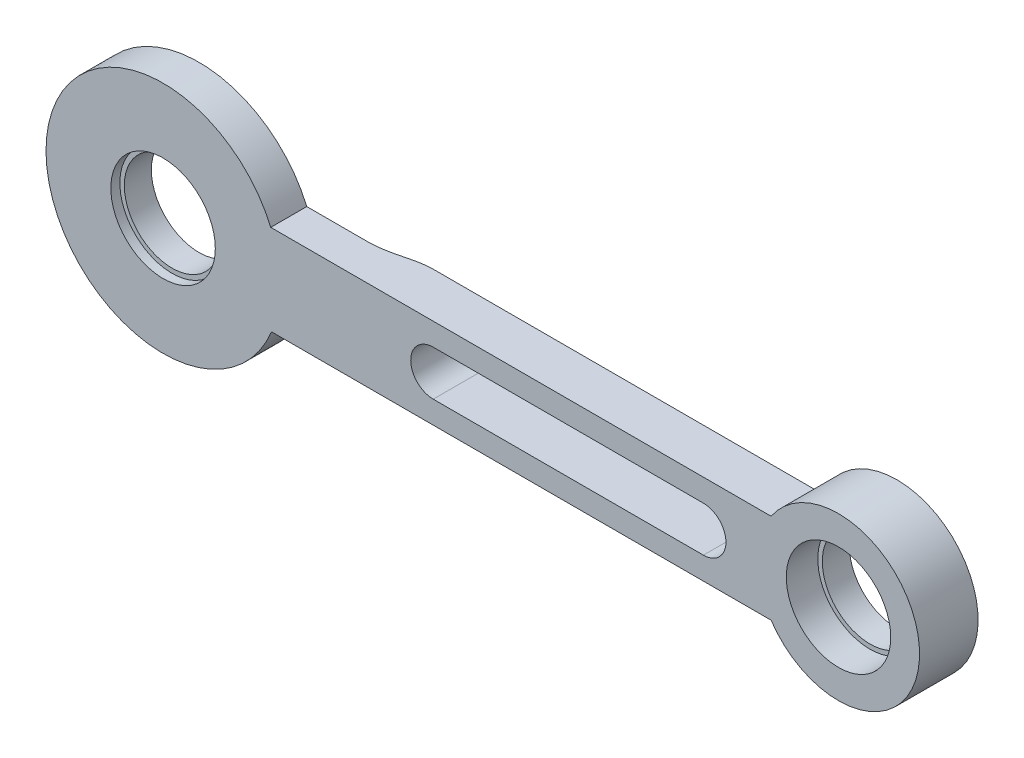
ISO-10303-21;
HEADER;
FILE_DESCRIPTION(('STEP AP214'),'2;1');
FILE_NAME('part.step','',(''),(''),'','','');
FILE_SCHEMA(('AUTOMOTIVE_DESIGN { 1 0 10303 214 1 1 1 1 }'));
ENDSEC;
DATA;
#1=APPLICATION_CONTEXT('core data for automotive mechanical design processes');
#2=APPLICATION_PROTOCOL_DEFINITION('international standard','automotive_design',2000,#1);
#3=PRODUCT_CONTEXT('',#1,'mechanical');
#4=PRODUCT('Part','Part','',(#3));
#5=PRODUCT_RELATED_PRODUCT_CATEGORY('part','',(#4));
#6=PRODUCT_DEFINITION_FORMATION('','',#4);
#7=PRODUCT_DEFINITION_CONTEXT('part definition',#1,'design');
#8=PRODUCT_DEFINITION('design','',#6,#7);
#9=PRODUCT_DEFINITION_SHAPE('','',#8);
#10=(LENGTH_UNIT() NAMED_UNIT(*) SI_UNIT(.MILLI.,.METRE.));
#11=(NAMED_UNIT(*) PLANE_ANGLE_UNIT() SI_UNIT($,.RADIAN.));
#12=(NAMED_UNIT(*) SI_UNIT($,.STERADIAN.) SOLID_ANGLE_UNIT());
#13=UNCERTAINTY_MEASURE_WITH_UNIT(LENGTH_MEASURE(1.E-05),#10,'distance_accuracy_value','');
#14=(GEOMETRIC_REPRESENTATION_CONTEXT(3) GLOBAL_UNCERTAINTY_ASSIGNED_CONTEXT((#13)) GLOBAL_UNIT_ASSIGNED_CONTEXT((#10,
#11,#12)) REPRESENTATION_CONTEXT('',''));
#15=CARTESIAN_POINT('',(0.,0.,0.));
#16=DIRECTION('',(0.,0.,1.));
#17=DIRECTION('',(1.,0.,0.));
#18=AXIS2_PLACEMENT_3D('',#15,#16,#17);
#19=CARTESIAN_POINT('',(37.5,-4.99999999999999,5.));
#20=DIRECTION('',(0.,1.,0.));
#21=DIRECTION('',(-1.,0.,0.));
#22=AXIS2_PLACEMENT_3D('',#19,#20,#21);
#23=PLANE('',#22);
#24=DIRECTION('',(-1.,0.,0.));
#25=VECTOR('',#24,1.);
#26=CARTESIAN_POINT('',(-17.4999999999999,-5.,0.999999999999997));
#27=LINE('',#26,#25);
#28=CARTESIAN_POINT('',(-18.7449979983983,-5.,0.999999999999997));
#29=VERTEX_POINT('',#28);
#30=CARTESIAN_POINT('',(-25.4573936343801,-5.,1.));
#31=VERTEX_POINT('',#30);
#32=EDGE_CURVE('E133',#29,#31,#27,.T.);
#33=ORIENTED_EDGE('',*,*,#32,.F.);
#34=CARTESIAN_POINT('',(-18.7449979983983,-5.,1.));
#35=CARTESIAN_POINT('',(-18.645035002539,-5.,1.00000153272607));
#36=CARTESIAN_POINT('',(-18.5450851848769,-5.,0.998172974073049));
#37=CARTESIAN_POINT('',(-18.3453271134592,-5.,0.991078252941705));
#38=CARTESIAN_POINT('',(-18.2455188346614,-5.,0.985812802857421));
#39=CARTESIAN_POINT('',(-17.9466679669266,-5.,0.96521094820551));
#40=CARTESIAN_POINT('',(-17.7479471933069,-5.,0.945067914377578));
#41=CARTESIAN_POINT('',(-17.3522243971255,-5.,0.893994344151307));
#42=CARTESIAN_POINT('',(-17.155220421683,-5.,0.863078359348636));
#43=CARTESIAN_POINT('',(-16.7626457238557,-5.,0.79268958938222));
#44=CARTESIAN_POINT('',(-16.5670760127962,-5.,0.753211273127115));
#45=CARTESIAN_POINT('',(-16.2120223789843,-5.,0.67587077404175));
#46=CARTESIAN_POINT('',(-16.0523226310872,-5.,0.638975831899379));
#47=CARTESIAN_POINT('',(-15.7334926391309,-5.,0.56280637017897));
#48=CARTESIAN_POINT('',(-15.5743624157081,-5.,0.523531765282259));
#49=CARTESIAN_POINT('',(-15.2564281965548,-5.,0.444526109617535));
#50=CARTESIAN_POINT('',(-15.0976240410658,-5.,0.404795685918549));
#51=CARTESIAN_POINT('',(-14.7795786568513,-5.,0.326973135921923));
#52=CARTESIAN_POINT('',(-14.6203373624904,-5.,0.288881271782074));
#53=CARTESIAN_POINT('',(-14.3001403680152,-5.,0.216613432195666));
#54=CARTESIAN_POINT('',(-14.1391801019006,-5.,0.182457267532553));
#55=CARTESIAN_POINT('',(-13.8160072151331,-5.,0.121002526075583));
#56=CARTESIAN_POINT('',(-13.6537954396745,-5.,0.0936996785188773));
#57=CARTESIAN_POINT('',(-13.4089562298765,-5.,0.0597580429322565));
#58=CARTESIAN_POINT('',(-13.3268162060853,-5.,0.0495911316604311));
#59=CARTESIAN_POINT('',(-13.1622503318064,-5.,0.0319273228839208));
#60=CARTESIAN_POINT('',(-13.0798244968798,-5.,0.0244302822516778));
#61=CARTESIAN_POINT('',(-12.9145661628705,-5.,0.0123225389868054));
#62=CARTESIAN_POINT('',(-12.8317331638515,-5.,0.0077185882753092));
#63=CARTESIAN_POINT('',(-12.6659349456241,-5.,0.00154848550261753));
#64=CARTESIAN_POINT('',(-12.5829696994703,-5.,-1.6937758530619E-05));
#65=CARTESIAN_POINT('',(-12.4999999999999,-5.,0.));
#66=B_SPLINE_CURVE_WITH_KNOTS('',3,(#34,#35,#36,#37,#38,#39,#40,#41,#42,#43,#44,#45,#46,#47,#48,
#49,#50,#51,#52,#53,#54,#55,#56,#57,#58,#59,#60,#61,#62,#63,#64,#65),.UNSPECIFIED.,.F.,.F.,(4,2,
2,2,2,2,2,2,2,2,2,2,2,2,2,4),(0.,0.29985037294068,0.599638613045173,1.19846015545193,
1.79647595339282,2.39487921406484,2.88657053781619,3.37827950074906,3.86937813424189,
4.3605550499575,4.85410531325687,5.34734724432537,5.59561077898411,5.8438610026218,
6.09268846404072,6.34157560011147),.UNSPECIFIED.);
#67=CARTESIAN_POINT('',(-12.4999999999999,-5.,0.));
#68=VERTEX_POINT('',#67);
#69=EDGE_CURVE('E61',#29,#68,#66,.T.);
#70=ORIENTED_EDGE('',*,*,#69,.T.);
#71=DIRECTION('',(1.,0.,0.));
#72=VECTOR('',#71,1.);
#73=CARTESIAN_POINT('',(37.5,-4.99999999999999,0.));
#74=LINE('',#73,#72);
#75=CARTESIAN_POINT('',(30.0166852264521,-4.99999999999999,0.));
#76=VERTEX_POINT('',#75);
#77=EDGE_CURVE('E130',#68,#76,#74,.T.);
#78=ORIENTED_EDGE('',*,*,#77,.T.);
#79=DIRECTION('',(0.,0.,1.));
#80=VECTOR('',#79,1.);
#81=CARTESIAN_POINT('',(30.0166852264521,-4.99999999999999,-1.5));
#82=LINE('',#81,#80);
#83=CARTESIAN_POINT('',(30.0166852264521,-4.99999999999999,5.));
#84=VERTEX_POINT('',#83);
#85=EDGE_CURVE('E260',#84,#76,#82,.F.);
#86=ORIENTED_EDGE('',*,*,#85,.F.);
#87=DIRECTION('',(1.,0.,0.));
#88=VECTOR('',#87,1.);
#89=CARTESIAN_POINT('',(37.5,-4.99999999999999,5.));
#90=LINE('',#89,#88);
#91=CARTESIAN_POINT('',(-25.4573936343801,-5.00000000000001,5.));
#92=VERTEX_POINT('',#91);
#93=EDGE_CURVE('E257',#92,#84,#90,.T.);
#94=ORIENTED_EDGE('',*,*,#93,.F.);
#95=DIRECTION('',(0.,0.,-1.));
#96=VECTOR('',#95,1.);
#97=CARTESIAN_POINT('',(-25.4573936343801,-5.00000000000001,5.));
#98=LINE('',#97,#96);
#99=EDGE_CURVE('E157',#92,#31,#98,.T.);
#100=ORIENTED_EDGE('',*,*,#99,.T.);
#101=EDGE_LOOP('',(#33,#70,#78,#86,#94,#100));
#102=FACE_BOUND('',#101,.T.);
#103=ADVANCED_FACE('F47',(#102),#23,.F.);
#104=CARTESIAN_POINT('',(37.5,5.00000000000002,5.));
#105=DIRECTION('',(0.,-1.,0.));
#106=DIRECTION('',(1.,0.,0.));
#107=AXIS2_PLACEMENT_3D('',#104,#105,#106);
#108=PLANE('',#107);
#109=DIRECTION('',(-1.,0.,0.));
#110=VECTOR('',#109,1.);
#111=CARTESIAN_POINT('',(37.5,5.00000000000002,0.));
#112=LINE('',#111,#110);
#113=CARTESIAN_POINT('',(30.0166852264521,5.00000000000001,0.));
#114=VERTEX_POINT('',#113);
#115=CARTESIAN_POINT('',(-12.4999999999999,5.,0.));
#116=VERTEX_POINT('',#115);
#117=EDGE_CURVE('E145',#114,#116,#112,.T.);
#118=ORIENTED_EDGE('',*,*,#117,.T.);
#119=CARTESIAN_POINT('',(-12.4999999999999,5.,0.));
#120=CARTESIAN_POINT('',(-12.6095711518551,5.,-4.98383637214607E-05));
#121=CARTESIAN_POINT('',(-12.7191253068558,5.,0.00270028230042894));
#122=CARTESIAN_POINT('',(-12.9379089839085,5.,0.0134254939519498));
#123=CARTESIAN_POINT('',(-13.047138670779,5.,0.0213971848556221));
#124=CARTESIAN_POINT('',(-13.2645559875564,5.,0.0421371276031877));
#125=CARTESIAN_POINT('',(-13.3727460797885,5.,0.0548800810208517));
#126=CARTESIAN_POINT('',(-13.588563282216,5.,0.0845279425443933));
#127=CARTESIAN_POINT('',(-13.6961903009899,5.,0.101433506316053));
#128=CARTESIAN_POINT('',(-13.9107557466472,5.,0.138649776144956));
#129=CARTESIAN_POINT('',(-14.0176946604001,5.,0.1589577147859));
#130=CARTESIAN_POINT('',(-14.2310301098835,5.,0.202204294090466));
#131=CARTESIAN_POINT('',(-14.33742666028,5.,0.225142863220315));
#132=CARTESIAN_POINT('',(-14.6563685370467,5.,0.296809609638656));
#133=CARTESIAN_POINT('',(-14.8682793147092,5.,0.348315935291766));
#134=CARTESIAN_POINT('',(-15.2304172172988,5.,0.437891500697268));
#135=CARTESIAN_POINT('',(-15.3807562252049,5.,0.475537983137605));
#136=CARTESIAN_POINT('',(-15.6816552383041,5.,0.54995596973172));
#137=CARTESIAN_POINT('',(-15.8322152409013,5.,0.586727484077341));
#138=CARTESIAN_POINT('',(-16.1336286983477,5.,0.657786294310186));
#139=CARTESIAN_POINT('',(-16.2844810682886,5.,0.692078133506446));
#140=CARTESIAN_POINT('',(-16.5869887191268,5.,0.756902188660594));
#141=CARTESIAN_POINT('',(-16.7386439293414,5.,0.787434730032313));
#142=CARTESIAN_POINT('',(-17.0431885757375,5.,0.843594270302262));
#143=CARTESIAN_POINT('',(-17.1960798819473,5.,0.869211270104647));
#144=CARTESIAN_POINT('',(-17.502739342034,5.,0.914366672136242));
#145=CARTESIAN_POINT('',(-17.6565073211032,5.,0.933906245808672));
#146=CARTESIAN_POINT('',(-17.9657728627875,5.,0.966017529983678));
#147=CARTESIAN_POINT('',(-18.1212752128153,5.,0.978544366383041));
#148=CARTESIAN_POINT('',(-18.4328340755706,5.,0.995546916365675));
#149=CARTESIAN_POINT('',(-18.5888909270491,5.,1.00001631360396));
#150=CARTESIAN_POINT('',(-18.7449979983983,5.,1.));
#151=B_SPLINE_CURVE_WITH_KNOTS('',3,(#119,#120,#121,#122,#123,#124,#125,#126,#127,#128,#129,
#130,#131,#132,#133,#134,#135,#136,#137,#138,#139,#140,#141,#142,#143,#144,#145,#146,#147,#148,
#149,#150),.UNSPECIFIED.,.F.,.F.,(4,2,2,2,2,2,2,2,2,2,2,2,2,2,2,4),(0.,0.328651699516361,
0.65708960627547,0.983810162129789,1.31058221371924,1.63708975517874,1.96358842014221,
2.61776563128536,3.08271693774218,3.54766282567773,4.01173403194446,4.47576503881052,
4.94073018769438,5.40560565744528,5.87342279670439,6.34160650549294),.UNSPECIFIED.);
#152=CARTESIAN_POINT('',(-18.7449979983983,5.,0.999999999999997));
#153=VERTEX_POINT('',#152);
#154=EDGE_CURVE('E11',#116,#153,#151,.T.);
#155=ORIENTED_EDGE('',*,*,#154,.T.);
#156=DIRECTION('',(1.,0.,0.));
#157=VECTOR('',#156,1.);
#158=CARTESIAN_POINT('',(-17.4999999999999,5.,0.999999999999997));
#159=LINE('',#158,#157);
#160=CARTESIAN_POINT('',(-25.5436542360656,5.,1.));
#161=VERTEX_POINT('',#160);
#162=EDGE_CURVE('E164',#161,#153,#159,.T.);
#163=ORIENTED_EDGE('',*,*,#162,.F.);
#164=DIRECTION('',(0.,0.,-1.));
#165=VECTOR('',#164,1.);
#166=CARTESIAN_POINT('',(-25.5436542360656,5.,5.));
#167=LINE('',#166,#165);
#168=CARTESIAN_POINT('',(-25.5436542360656,5.,5.));
#169=VERTEX_POINT('',#168);
#170=EDGE_CURVE('E161',#161,#169,#167,.F.);
#171=ORIENTED_EDGE('',*,*,#170,.T.);
#172=DIRECTION('',(-1.,0.,0.));
#173=VECTOR('',#172,1.);
#174=CARTESIAN_POINT('',(37.5,5.00000000000002,5.));
#175=LINE('',#174,#173);
#176=CARTESIAN_POINT('',(30.0166852264521,5.00000000000001,5.));
#177=VERTEX_POINT('',#176);
#178=EDGE_CURVE('E144',#177,#169,#175,.T.);
#179=ORIENTED_EDGE('',*,*,#178,.F.);
#180=DIRECTION('',(0.,0.,1.));
#181=VECTOR('',#180,1.);
#182=CARTESIAN_POINT('',(30.0166852264521,5.00000000000001,-1.5));
#183=LINE('',#182,#181);
#184=EDGE_CURVE('E208',#114,#177,#183,.T.);
#185=ORIENTED_EDGE('',*,*,#184,.F.);
#186=EDGE_LOOP('',(#118,#155,#163,#171,#179,#185));
#187=FACE_BOUND('',#186,.T.);
#188=ADVANCED_FACE('F277',(#187),#108,.F.);
#189=CARTESIAN_POINT('',(37.5,0.,5.));
#190=DIRECTION('',(0.,0.,1.));
#191=DIRECTION('',(1.,0.,0.));
#192=AXIS2_PLACEMENT_3D('',#189,#190,#191);
#193=PLANE('',#192);
#194=CARTESIAN_POINT('',(-37.4999999999999,-0.10350820252582,5.));
#195=DIRECTION('',(0.,0.,-1.));
#196=DIRECTION('',(-1.,0.,0.));
#197=AXIS2_PLACEMENT_3D('',#194,#195,#196);
#198=CIRCLE('',#197,13.);
#199=EDGE_CURVE('E152',#92,#169,#198,.T.);
#200=ORIENTED_EDGE('',*,*,#199,.F.);
#201=ORIENTED_EDGE('',*,*,#93,.T.);
#202=CARTESIAN_POINT('',(37.5,0.,5.));
#203=DIRECTION('',(0.,0.,-1.));
#204=DIRECTION('',(-1.,0.,0.));
#205=AXIS2_PLACEMENT_3D('',#202,#203,#204);
#206=CIRCLE('',#205,9.);
#207=EDGE_CURVE('E194',#177,#84,#206,.T.);
#208=ORIENTED_EDGE('',*,*,#207,.F.);
#209=ORIENTED_EDGE('',*,*,#178,.T.);
#210=EDGE_LOOP('',(#200,#201,#208,#209));
#211=FACE_BOUND('',#210,.T.);
#212=CARTESIAN_POINT('',(37.5,0.,5.));
#213=DIRECTION('',(0.,0.,1.));
#214=DIRECTION('',(1.,0.,0.));
#215=AXIS2_PLACEMENT_3D('',#212,#213,#214);
#216=CIRCLE('',#215,5.8);
#217=CARTESIAN_POINT('',(43.3,0.,5.));
#218=VERTEX_POINT('',#217);
#219=EDGE_CURVE('E195',#218,#218,#216,.T.);
#220=ORIENTED_EDGE('',*,*,#219,.F.);
#221=EDGE_LOOP('',(#220));
#222=FACE_BOUND('',#221,.T.);
#223=DIRECTION('',(1.,0.,0.));
#224=VECTOR('',#223,1.);
#225=CARTESIAN_POINT('',(-7.49999999999999,-2.50000000000001,5.));
#226=LINE('',#225,#224);
#227=CARTESIAN_POINT('',(-7.49999999999999,-2.50000000000001,5.));
#228=VERTEX_POINT('',#227);
#229=CARTESIAN_POINT('',(22.5,-2.5,5.));
#230=VERTEX_POINT('',#229);
#231=EDGE_CURVE('E215',#228,#230,#226,.T.);
#232=ORIENTED_EDGE('',*,*,#231,.F.);
#233=CARTESIAN_POINT('',(-7.49999999999999,0.,5.));
#234=DIRECTION('',(0.,0.,1.));
#235=DIRECTION('',(1.,0.,0.));
#236=AXIS2_PLACEMENT_3D('',#233,#234,#235);
#237=CIRCLE('',#236,2.5);
#238=CARTESIAN_POINT('',(-7.49999999999999,2.5,5.));
#239=VERTEX_POINT('',#238);
#240=EDGE_CURVE('E212',#239,#228,#237,.T.);
#241=ORIENTED_EDGE('',*,*,#240,.F.);
#242=DIRECTION('',(-1.,0.,0.));
#243=VECTOR('',#242,1.);
#244=CARTESIAN_POINT('',(-7.49999999999999,2.5,5.));
#245=LINE('',#244,#243);
#246=CARTESIAN_POINT('',(22.5,2.5,5.));
#247=VERTEX_POINT('',#246);
#248=EDGE_CURVE('E223',#247,#239,#245,.T.);
#249=ORIENTED_EDGE('',*,*,#248,.F.);
#250=CARTESIAN_POINT('',(22.5,0.,5.));
#251=DIRECTION('',(0.,0.,1.));
#252=DIRECTION('',(1.,0.,0.));
#253=AXIS2_PLACEMENT_3D('',#250,#251,#252);
#254=CIRCLE('',#253,2.5);
#255=EDGE_CURVE('E219',#230,#247,#254,.T.);
#256=ORIENTED_EDGE('',*,*,#255,.F.);
#257=EDGE_LOOP('',(#232,#241,#249,#256));
#258=FACE_BOUND('',#257,.T.);
#259=CARTESIAN_POINT('',(-37.4999999999999,-0.10350820252582,5.));
#260=DIRECTION('',(0.,0.,1.));
#261=DIRECTION('',(1.,0.,0.));
#262=AXIS2_PLACEMENT_3D('',#259,#260,#261);
#263=CIRCLE('',#262,5.8);
#264=CARTESIAN_POINT('',(-31.6999999999999,-0.10350820252582,5.));
#265=VERTEX_POINT('',#264);
#266=EDGE_CURVE('E169',#265,#265,#263,.T.);
#267=ORIENTED_EDGE('',*,*,#266,.F.);
#268=EDGE_LOOP('',(#267));
#269=FACE_BOUND('',#268,.T.);
#270=ADVANCED_FACE('F281',(#211,#222,#258,#269),#193,.T.);
#271=CARTESIAN_POINT('',(37.5,0.,0.));
#272=DIRECTION('',(0.,0.,1.));
#273=DIRECTION('',(1.,0.,0.));
#274=AXIS2_PLACEMENT_3D('',#271,#272,#273);
#275=PLANE('',#274);
#276=ORIENTED_EDGE('',*,*,#77,.F.);
#277=CARTESIAN_POINT('',(-12.4999999999999,0.,0.));
#278=DIRECTION('',(0.,0.,1.));
#279=DIRECTION('',(-1.,0.,0.));
#280=AXIS2_PLACEMENT_3D('',#277,#278,#279);
#281=CIRCLE('',#280,5.);
#282=EDGE_CURVE('E141',#116,#68,#281,.T.);
#283=ORIENTED_EDGE('',*,*,#282,.F.);
#284=ORIENTED_EDGE('',*,*,#117,.F.);
#285=CARTESIAN_POINT('',(37.5,0.,0.));
#286=DIRECTION('',(0.,0.,1.));
#287=DIRECTION('',(1.,0.,0.));
#288=AXIS2_PLACEMENT_3D('',#285,#286,#287);
#289=CIRCLE('',#288,9.);
#290=EDGE_CURVE('E142',#76,#114,#289,.F.);
#291=ORIENTED_EDGE('',*,*,#290,.F.);
#292=EDGE_LOOP('',(#276,#283,#284,#291));
#293=FACE_BOUND('',#292,.T.);
#294=CARTESIAN_POINT('',(-7.49999999999999,0.,0.));
#295=DIRECTION('',(0.,0.,1.));
#296=DIRECTION('',(1.,0.,0.));
#297=AXIS2_PLACEMENT_3D('',#294,#295,#296);
#298=CIRCLE('',#297,2.5);
#299=CARTESIAN_POINT('',(-7.49999999999999,2.5,0.));
#300=VERTEX_POINT('',#299);
#301=CARTESIAN_POINT('',(-7.49999999999999,-2.50000000000001,0.));
#302=VERTEX_POINT('',#301);
#303=EDGE_CURVE('E211',#300,#302,#298,.T.);
#304=ORIENTED_EDGE('',*,*,#303,.T.);
#305=DIRECTION('',(1.,0.,0.));
#306=VECTOR('',#305,1.);
#307=CARTESIAN_POINT('',(-7.49999999999999,-2.50000000000001,0.));
#308=LINE('',#307,#306);
#309=CARTESIAN_POINT('',(22.5,-2.5,0.));
#310=VERTEX_POINT('',#309);
#311=EDGE_CURVE('E230',#302,#310,#308,.T.);
#312=ORIENTED_EDGE('',*,*,#311,.T.);
#313=CARTESIAN_POINT('',(22.5,0.,0.));
#314=DIRECTION('',(0.,0.,1.));
#315=DIRECTION('',(1.,0.,0.));
#316=AXIS2_PLACEMENT_3D('',#313,#314,#315);
#317=CIRCLE('',#316,2.5);
#318=CARTESIAN_POINT('',(22.5,2.5,0.));
#319=VERTEX_POINT('',#318);
#320=EDGE_CURVE('E234',#310,#319,#317,.T.);
#321=ORIENTED_EDGE('',*,*,#320,.T.);
#322=DIRECTION('',(-1.,0.,0.));
#323=VECTOR('',#322,1.);
#324=CARTESIAN_POINT('',(-7.49999999999999,2.5,0.));
#325=LINE('',#324,#323);
#326=EDGE_CURVE('E216',#319,#300,#325,.T.);
#327=ORIENTED_EDGE('',*,*,#326,.T.);
#328=EDGE_LOOP('',(#304,#312,#321,#327));
#329=FACE_BOUND('',#328,.T.);
#330=ADVANCED_FACE('F138',(#293,#329),#275,.F.);
#331=CARTESIAN_POINT('',(-7.49999999999999,0.,5.));
#332=DIRECTION('',(0.,0.,-1.));
#333=DIRECTION('',(-1.,0.,0.));
#334=AXIS2_PLACEMENT_3D('',#331,#332,#333);
#335=CYLINDRICAL_SURFACE('',#334,2.5);
#336=ORIENTED_EDGE('',*,*,#303,.F.);
#337=DIRECTION('',(0.,0.,-1.));
#338=VECTOR('',#337,1.);
#339=CARTESIAN_POINT('',(-7.49999999999999,2.5,5.));
#340=LINE('',#339,#338);
#341=EDGE_CURVE('E226',#239,#300,#340,.T.);
#342=ORIENTED_EDGE('',*,*,#341,.F.);
#343=ORIENTED_EDGE('',*,*,#240,.T.);
#344=DIRECTION('',(0.,0.,-1.));
#345=VECTOR('',#344,1.);
#346=CARTESIAN_POINT('',(-7.49999999999999,-2.50000000000001,5.));
#347=LINE('',#346,#345);
#348=EDGE_CURVE('E250',#228,#302,#347,.T.);
#349=ORIENTED_EDGE('',*,*,#348,.T.);
#350=EDGE_LOOP('',(#336,#342,#343,#349));
#351=FACE_BOUND('',#350,.T.);
#352=ADVANCED_FACE('F350',(#351),#335,.F.);
#353=CARTESIAN_POINT('',(-7.49999999999999,-2.50000000000001,5.));
#354=DIRECTION('',(0.,1.,0.));
#355=DIRECTION('',(-1.,0.,0.));
#356=AXIS2_PLACEMENT_3D('',#353,#354,#355);
#357=PLANE('',#356);
#358=ORIENTED_EDGE('',*,*,#311,.F.);
#359=ORIENTED_EDGE('',*,*,#348,.F.);
#360=ORIENTED_EDGE('',*,*,#231,.T.);
#361=DIRECTION('',(0.,0.,-1.));
#362=VECTOR('',#361,1.);
#363=CARTESIAN_POINT('',(22.5,-2.5,5.));
#364=LINE('',#363,#362);
#365=EDGE_CURVE('E247',#230,#310,#364,.T.);
#366=ORIENTED_EDGE('',*,*,#365,.T.);
#367=EDGE_LOOP('',(#358,#359,#360,#366));
#368=FACE_BOUND('',#367,.T.);
#369=ADVANCED_FACE('F346',(#368),#357,.T.);
#370=CARTESIAN_POINT('',(22.5,0.,5.));
#371=DIRECTION('',(0.,0.,-1.));
#372=DIRECTION('',(-1.,0.,0.));
#373=AXIS2_PLACEMENT_3D('',#370,#371,#372);
#374=CYLINDRICAL_SURFACE('',#373,2.5);
#375=ORIENTED_EDGE('',*,*,#320,.F.);
#376=ORIENTED_EDGE('',*,*,#365,.F.);
#377=ORIENTED_EDGE('',*,*,#255,.T.);
#378=DIRECTION('',(0.,0.,-1.));
#379=VECTOR('',#378,1.);
#380=CARTESIAN_POINT('',(22.5,2.5,5.));
#381=LINE('',#380,#379);
#382=EDGE_CURVE('E244',#247,#319,#381,.T.);
#383=ORIENTED_EDGE('',*,*,#382,.T.);
#384=EDGE_LOOP('',(#375,#376,#377,#383));
#385=FACE_BOUND('',#384,.T.);
#386=ADVANCED_FACE('F342',(#385),#374,.F.);
#387=CARTESIAN_POINT('',(-7.49999999999999,2.5,5.));
#388=DIRECTION('',(0.,-1.,0.));
#389=DIRECTION('',(1.,0.,0.));
#390=AXIS2_PLACEMENT_3D('',#387,#388,#389);
#391=PLANE('',#390);
#392=ORIENTED_EDGE('',*,*,#326,.F.);
#393=ORIENTED_EDGE('',*,*,#382,.F.);
#394=ORIENTED_EDGE('',*,*,#248,.T.);
#395=ORIENTED_EDGE('',*,*,#341,.T.);
#396=EDGE_LOOP('',(#392,#393,#394,#395));
#397=FACE_BOUND('',#396,.T.);
#398=ADVANCED_FACE('F338',(#397),#391,.T.);
#399=CARTESIAN_POINT('',(37.5,0.,-1.5));
#400=DIRECTION('',(0.,0.,1.));
#401=DIRECTION('',(1.,0.,0.));
#402=AXIS2_PLACEMENT_3D('',#399,#400,#401);
#403=CYLINDRICAL_SURFACE('',#402,9.);
#404=CARTESIAN_POINT('',(37.5,0.,-1.5));
#405=DIRECTION('',(0.,0.,-1.));
#406=DIRECTION('',(-1.,0.,0.));
#407=AXIS2_PLACEMENT_3D('',#404,#405,#406);
#408=CIRCLE('',#407,9.);
#409=CARTESIAN_POINT('',(28.5,0.,-1.5));
#410=VERTEX_POINT('',#409);
#411=EDGE_CURVE('E202',#410,#410,#408,.T.);
#412=ORIENTED_EDGE('',*,*,#411,.F.);
#413=EDGE_LOOP('',(#412));
#414=FACE_BOUND('',#413,.T.);
#415=ORIENTED_EDGE('',*,*,#290,.T.);
#416=ORIENTED_EDGE('',*,*,#184,.T.);
#417=ORIENTED_EDGE('',*,*,#207,.T.);
#418=ORIENTED_EDGE('',*,*,#85,.T.);
#419=EDGE_LOOP('',(#415,#416,#417,#418));
#420=FACE_BOUND('',#419,.T.);
#421=ADVANCED_FACE('F291',(#414,#420),#403,.T.);
#422=CARTESIAN_POINT('',(37.5,0.,-1.5));
#423=DIRECTION('',(0.,0.,-1.));
#424=DIRECTION('',(-1.,0.,0.));
#425=AXIS2_PLACEMENT_3D('',#422,#423,#424);
#426=PLANE('',#425);
#427=CARTESIAN_POINT('',(37.5,0.,-1.5));
#428=DIRECTION('',(0.,0.,-1.));
#429=DIRECTION('',(-1.,0.,0.));
#430=AXIS2_PLACEMENT_3D('',#427,#428,#429);
#431=CIRCLE('',#430,5.3);
#432=CARTESIAN_POINT('',(32.2,0.,-1.5));
#433=VERTEX_POINT('',#432);
#434=EDGE_CURVE('E189',#433,#433,#431,.T.);
#435=ORIENTED_EDGE('',*,*,#434,.F.);
#436=EDGE_LOOP('',(#435));
#437=FACE_BOUND('',#436,.T.);
#438=ORIENTED_EDGE('',*,*,#411,.T.);
#439=EDGE_LOOP('',(#438));
#440=FACE_BOUND('',#439,.T.);
#441=ADVANCED_FACE('F331',(#437,#440),#426,.T.);
#442=CARTESIAN_POINT('',(37.5,0.,1.5));
#443=DIRECTION('',(0.,0.,1.));
#444=DIRECTION('',(1.,0.,0.));
#445=AXIS2_PLACEMENT_3D('',#442,#443,#444);
#446=CYLINDRICAL_SURFACE('',#445,5.8);
#447=CARTESIAN_POINT('',(37.5,0.,1.5));
#448=DIRECTION('',(0.,0.,1.));
#449=DIRECTION('',(1.,0.,0.));
#450=AXIS2_PLACEMENT_3D('',#447,#448,#449);
#451=CIRCLE('',#450,5.8);
#452=CARTESIAN_POINT('',(43.3,0.,1.5));
#453=VERTEX_POINT('',#452);
#454=EDGE_CURVE('E190',#453,#453,#451,.T.);
#455=ORIENTED_EDGE('',*,*,#454,.F.);
#456=EDGE_LOOP('',(#455));
#457=FACE_BOUND('',#456,.T.);
#458=ORIENTED_EDGE('',*,*,#219,.T.);
#459=EDGE_LOOP('',(#458));
#460=FACE_BOUND('',#459,.T.);
#461=ADVANCED_FACE('F327',(#457,#460),#446,.F.);
#462=CARTESIAN_POINT('',(37.5,0.,1.5));
#463=DIRECTION('',(0.,0.,1.));
#464=DIRECTION('',(1.,0.,0.));
#465=AXIS2_PLACEMENT_3D('',#462,#463,#464);
#466=PLANE('',#465);
#467=CARTESIAN_POINT('',(37.5,0.,1.5));
#468=DIRECTION('',(0.,0.,1.));
#469=DIRECTION('',(1.,0.,0.));
#470=AXIS2_PLACEMENT_3D('',#467,#468,#469);
#471=CIRCLE('',#470,5.3);
#472=CARTESIAN_POINT('',(42.8,0.,1.5));
#473=VERTEX_POINT('',#472);
#474=EDGE_CURVE('E185',#473,#473,#471,.T.);
#475=ORIENTED_EDGE('',*,*,#474,.F.);
#476=EDGE_LOOP('',(#475));
#477=FACE_BOUND('',#476,.T.);
#478=ORIENTED_EDGE('',*,*,#454,.T.);
#479=EDGE_LOOP('',(#478));
#480=FACE_BOUND('',#479,.T.);
#481=ADVANCED_FACE('F323',(#477,#480),#466,.T.);
#482=CARTESIAN_POINT('',(37.5,0.,-5.5));
#483=DIRECTION('',(0.,0.,1.));
#484=DIRECTION('',(1.,0.,0.));
#485=AXIS2_PLACEMENT_3D('',#482,#483,#484);
#486=CYLINDRICAL_SURFACE('',#485,5.3);
#487=ORIENTED_EDGE('',*,*,#434,.T.);
#488=EDGE_LOOP('',(#487));
#489=FACE_BOUND('',#488,.T.);
#490=ORIENTED_EDGE('',*,*,#474,.T.);
#491=EDGE_LOOP('',(#490));
#492=FACE_BOUND('',#491,.T.);
#493=ADVANCED_FACE('F304',(#489,#492),#486,.F.);
#494=CARTESIAN_POINT('',(-37.4999999999999,-0.10350820252582,1.));
#495=DIRECTION('',(0.,0.,-1.));
#496=DIRECTION('',(-1.,0.,0.));
#497=AXIS2_PLACEMENT_3D('',#494,#495,#496);
#498=PLANE('',#497);
#499=ORIENTED_EDGE('',*,*,#162,.T.);
#500=CARTESIAN_POINT('',(-12.4999999999999,0.,1.));
#501=DIRECTION('',(0.,0.,-1.));
#502=DIRECTION('',(-1.,0.,0.));
#503=AXIS2_PLACEMENT_3D('',#500,#501,#502);
#504=CIRCLE('',#503,8.);
#505=EDGE_CURVE('E135',#153,#29,#504,.F.);
#506=ORIENTED_EDGE('',*,*,#505,.T.);
#507=ORIENTED_EDGE('',*,*,#32,.T.);
#508=CARTESIAN_POINT('',(-37.4999999999999,-0.10350820252582,1.));
#509=DIRECTION('',(0.,0.,-1.));
#510=DIRECTION('',(-1.,0.,0.));
#511=AXIS2_PLACEMENT_3D('',#508,#509,#510);
#512=CIRCLE('',#511,13.);
#513=EDGE_CURVE('E148',#31,#161,#512,.T.);
#514=ORIENTED_EDGE('',*,*,#513,.T.);
#515=EDGE_LOOP('',(#499,#506,#507,#514));
#516=FACE_BOUND('',#515,.T.);
#517=CARTESIAN_POINT('',(-37.4999999999999,-0.10350820252582,1.));
#518=DIRECTION('',(0.,0.,-1.));
#519=DIRECTION('',(-1.,0.,0.));
#520=AXIS2_PLACEMENT_3D('',#517,#518,#519);
#521=CIRCLE('',#520,5.3);
#522=CARTESIAN_POINT('',(-42.7999999999999,-0.10350820252582,1.));
#523=VERTEX_POINT('',#522);
#524=EDGE_CURVE('E181',#523,#523,#521,.T.);
#525=ORIENTED_EDGE('',*,*,#524,.F.);
#526=EDGE_LOOP('',(#525));
#527=FACE_BOUND('',#526,.T.);
#528=ADVANCED_FACE('F300',(#516,#527),#498,.T.);
#529=CARTESIAN_POINT('',(-37.4999999999999,-0.10350820252582,4.));
#530=DIRECTION('',(0.,0.,-1.));
#531=DIRECTION('',(-1.,0.,0.));
#532=AXIS2_PLACEMENT_3D('',#529,#530,#531);
#533=CYLINDRICAL_SURFACE('',#532,5.3);
#534=CARTESIAN_POINT('',(-37.4999999999999,-0.10350820252582,4.));
#535=DIRECTION('',(0.,0.,-1.));
#536=DIRECTION('',(-1.,0.,0.));
#537=AXIS2_PLACEMENT_3D('',#534,#535,#536);
#538=CIRCLE('',#537,5.3);
#539=CARTESIAN_POINT('',(-42.7999999999999,-0.10350820252582,4.));
#540=VERTEX_POINT('',#539);
#541=EDGE_CURVE('E174',#540,#540,#538,.T.);
#542=ORIENTED_EDGE('',*,*,#541,.F.);
#543=EDGE_LOOP('',(#542));
#544=FACE_BOUND('',#543,.T.);
#545=ORIENTED_EDGE('',*,*,#524,.T.);
#546=EDGE_LOOP('',(#545));
#547=FACE_BOUND('',#546,.T.);
#548=ADVANCED_FACE('F303',(#544,#547),#533,.F.);
#549=CARTESIAN_POINT('',(-37.4999999999999,-0.10350820252582,4.));
#550=DIRECTION('',(0.,0.,1.));
#551=DIRECTION('',(1.,0.,0.));
#552=AXIS2_PLACEMENT_3D('',#549,#550,#551);
#553=PLANE('',#552);
#554=CARTESIAN_POINT('',(-37.4999999999999,-0.10350820252582,4.));
#555=DIRECTION('',(0.,0.,1.));
#556=DIRECTION('',(1.,0.,0.));
#557=AXIS2_PLACEMENT_3D('',#554,#555,#556);
#558=CIRCLE('',#557,5.8);
#559=CARTESIAN_POINT('',(-31.6999999999999,-0.10350820252582,4.));
#560=VERTEX_POINT('',#559);
#561=EDGE_CURVE('E170',#560,#560,#558,.T.);
#562=ORIENTED_EDGE('',*,*,#561,.T.);
#563=EDGE_LOOP('',(#562));
#564=FACE_BOUND('',#563,.T.);
#565=ORIENTED_EDGE('',*,*,#541,.T.);
#566=EDGE_LOOP('',(#565));
#567=FACE_BOUND('',#566,.T.);
#568=ADVANCED_FACE('F309',(#564,#567),#553,.T.);
#569=CARTESIAN_POINT('',(-37.4999999999999,-0.10350820252582,4.));
#570=DIRECTION('',(0.,0.,1.));
#571=DIRECTION('',(1.,0.,0.));
#572=AXIS2_PLACEMENT_3D('',#569,#570,#571);
#573=CYLINDRICAL_SURFACE('',#572,5.8);
#574=ORIENTED_EDGE('',*,*,#561,.F.);
#575=EDGE_LOOP('',(#574));
#576=FACE_BOUND('',#575,.T.);
#577=ORIENTED_EDGE('',*,*,#266,.T.);
#578=EDGE_LOOP('',(#577));
#579=FACE_BOUND('',#578,.T.);
#580=ADVANCED_FACE('F316',(#576,#579),#573,.F.);
#581=CARTESIAN_POINT('',(-37.4999999999999,-0.10350820252582,5.));
#582=DIRECTION('',(0.,0.,-1.));
#583=DIRECTION('',(-1.,0.,0.));
#584=AXIS2_PLACEMENT_3D('',#581,#582,#583);
#585=CYLINDRICAL_SURFACE('',#584,13.);
#586=ORIENTED_EDGE('',*,*,#170,.F.);
#587=ORIENTED_EDGE('',*,*,#513,.F.);
#588=ORIENTED_EDGE('',*,*,#99,.F.);
#589=ORIENTED_EDGE('',*,*,#199,.T.);
#590=EDGE_LOOP('',(#586,#587,#588,#589));
#591=FACE_BOUND('',#590,.T.);
#592=ADVANCED_FACE('F298',(#591),#585,.T.);
#593=CARTESIAN_POINT('',(-12.4999999999999,0.,-4.));
#594=DIRECTION('',(0.,0.,-1.));
#595=DIRECTION('',(-1.,0.,0.));
#596=AXIS2_PLACEMENT_3D('',#593,#594,#595);
#597=TOROIDAL_SURFACE('',#596,8.,5.);
#598=ORIENTED_EDGE('',*,*,#154,.F.);
#599=ORIENTED_EDGE('',*,*,#282,.T.);
#600=ORIENTED_EDGE('',*,*,#69,.F.);
#601=ORIENTED_EDGE('',*,*,#505,.F.);
#602=EDGE_LOOP('',(#598,#599,#600,#601));
#603=FACE_BOUND('',#602,.T.);
#604=ADVANCED_FACE('F49',(#603),#597,.F.);
#605=CLOSED_SHELL('',(#103,#188,#270,#330,#352,#369,#386,#398,#421,#441,#461,#481,#493,#528,
#548,#568,#580,#592,#604));
#606=MANIFOLD_SOLID_BREP('B2',#605);
#607=ADVANCED_BREP_SHAPE_REPRESENTATION('',(#18,#606),#14);
#608=SHAPE_DEFINITION_REPRESENTATION(#9,#607);
ENDSEC;
END-ISO-10303-21;
